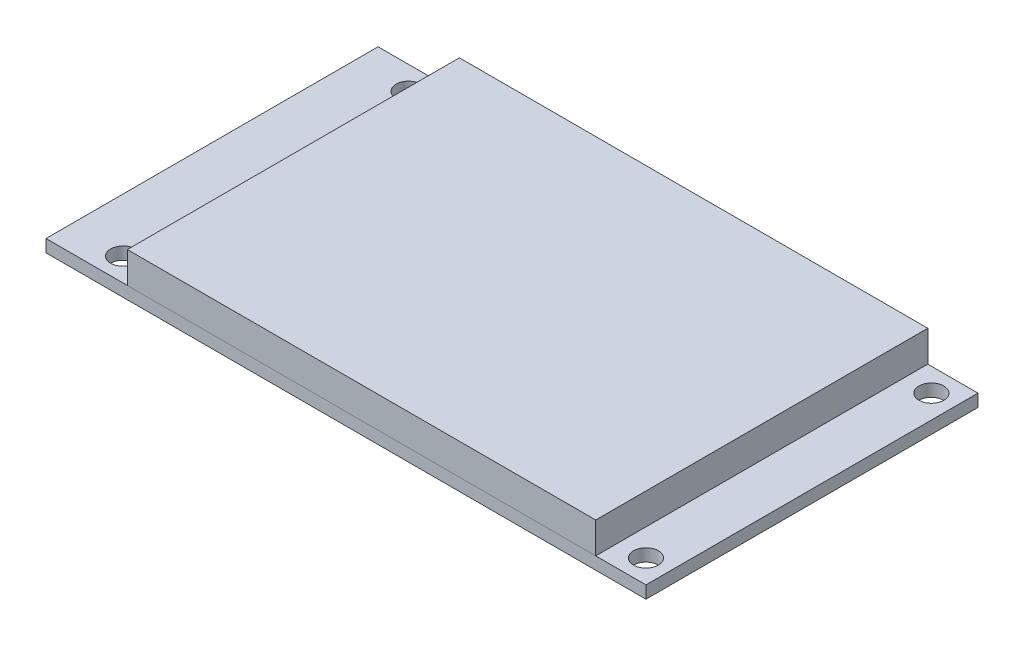
ISO-10303-21;
HEADER;
FILE_DESCRIPTION(('STEP AP214'),'2;1');
FILE_NAME('part.step','',(''),(''),'','','');
FILE_SCHEMA(('AUTOMOTIVE_DESIGN { 1 0 10303 214 1 1 1 1 }'));
ENDSEC;
DATA;
#1=APPLICATION_CONTEXT('core data for automotive mechanical design processes');
#2=APPLICATION_PROTOCOL_DEFINITION('international standard','automotive_design',2000,#1);
#3=PRODUCT_CONTEXT('',#1,'mechanical');
#4=PRODUCT('Part','Part','',(#3));
#5=PRODUCT_RELATED_PRODUCT_CATEGORY('part','',(#4));
#6=PRODUCT_DEFINITION_FORMATION('','',#4);
#7=PRODUCT_DEFINITION_CONTEXT('part definition',#1,'design');
#8=PRODUCT_DEFINITION('design','',#6,#7);
#9=PRODUCT_DEFINITION_SHAPE('','',#8);
#10=(LENGTH_UNIT() NAMED_UNIT(*) SI_UNIT(.MILLI.,.METRE.));
#11=(NAMED_UNIT(*) PLANE_ANGLE_UNIT() SI_UNIT($,.RADIAN.));
#12=(NAMED_UNIT(*) SI_UNIT($,.STERADIAN.) SOLID_ANGLE_UNIT());
#13=UNCERTAINTY_MEASURE_WITH_UNIT(LENGTH_MEASURE(1.E-05),#10,'distance_accuracy_value','');
#14=(GEOMETRIC_REPRESENTATION_CONTEXT(3) GLOBAL_UNCERTAINTY_ASSIGNED_CONTEXT((#13)) GLOBAL_UNIT_ASSIGNED_CONTEXT((#10,
#11,#12)) REPRESENTATION_CONTEXT('',''));
#15=CARTESIAN_POINT('',(0.,0.,0.));
#16=DIRECTION('',(0.,0.,1.));
#17=DIRECTION('',(1.,0.,0.));
#18=AXIS2_PLACEMENT_3D('',#15,#16,#17);
#19=CARTESIAN_POINT('',(-28.13,5.6,-21.36));
#20=DIRECTION('',(1.,0.,0.));
#21=DIRECTION('',(0.,0.,-1.));
#22=AXIS2_PLACEMENT_3D('',#19,#20,#21);
#23=PLANE('',#22);
#24=DIRECTION('',(0.,0.,1.));
#25=VECTOR('',#24,1.);
#26=CARTESIAN_POINT('',(-28.13,1.6,-21.36));
#27=LINE('',#26,#25);
#28=CARTESIAN_POINT('',(-28.13,1.6,-21.36));
#29=VERTEX_POINT('',#28);
#30=CARTESIAN_POINT('',(-28.13,1.6,21.36));
#31=VERTEX_POINT('',#30);
#32=EDGE_CURVE('E117',#29,#31,#27,.T.);
#33=ORIENTED_EDGE('',*,*,#32,.T.);
#34=DIRECTION('',(0.,-1.,0.));
#35=VECTOR('',#34,1.);
#36=CARTESIAN_POINT('',(-28.13,5.6,21.36));
#37=LINE('',#36,#35);
#38=CARTESIAN_POINT('',(-28.13,5.6,21.36));
#39=VERTEX_POINT('',#38);
#40=EDGE_CURVE('E12',#39,#31,#37,.T.);
#41=ORIENTED_EDGE('',*,*,#40,.F.);
#42=DIRECTION('',(0.,0.,1.));
#43=VECTOR('',#42,1.);
#44=CARTESIAN_POINT('',(-28.13,5.6,-21.36));
#45=LINE('',#44,#43);
#46=CARTESIAN_POINT('',(-28.13,5.6,-21.36));
#47=VERTEX_POINT('',#46);
#48=EDGE_CURVE('E101',#47,#39,#45,.T.);
#49=ORIENTED_EDGE('',*,*,#48,.F.);
#50=DIRECTION('',(0.,-1.,0.));
#51=VECTOR('',#50,1.);
#52=CARTESIAN_POINT('',(-28.13,5.6,-21.36));
#53=LINE('',#52,#51);
#54=EDGE_CURVE('E113',#47,#29,#53,.T.);
#55=ORIENTED_EDGE('',*,*,#54,.T.);
#56=EDGE_LOOP('',(#33,#41,#49,#55));
#57=FACE_BOUND('',#56,.T.);
#58=ADVANCED_FACE('F49',(#57),#23,.F.);
#59=CARTESIAN_POINT('',(-28.13,5.6,21.36));
#60=DIRECTION('',(0.,0.,-1.));
#61=DIRECTION('',(-1.,0.,0.));
#62=AXIS2_PLACEMENT_3D('',#59,#60,#61);
#63=PLANE('',#62);
#64=DIRECTION('',(1.,0.,0.));
#65=VECTOR('',#64,1.);
#66=CARTESIAN_POINT('',(-28.13,1.6,21.36));
#67=LINE('',#66,#65);
#68=CARTESIAN_POINT('',(32.13,1.6,21.36));
#69=VERTEX_POINT('',#68);
#70=EDGE_CURVE('E106',#31,#69,#67,.T.);
#71=ORIENTED_EDGE('',*,*,#70,.T.);
#72=DIRECTION('',(0.,-1.,0.));
#73=VECTOR('',#72,1.);
#74=CARTESIAN_POINT('',(32.13,5.6,21.36));
#75=LINE('',#74,#73);
#76=CARTESIAN_POINT('',(32.13,5.6,21.36));
#77=VERTEX_POINT('',#76);
#78=EDGE_CURVE('E58',#77,#69,#75,.T.);
#79=ORIENTED_EDGE('',*,*,#78,.F.);
#80=DIRECTION('',(1.,0.,0.));
#81=VECTOR('',#80,1.);
#82=CARTESIAN_POINT('',(-28.13,5.6,21.36));
#83=LINE('',#82,#81);
#84=EDGE_CURVE('E96',#39,#77,#83,.T.);
#85=ORIENTED_EDGE('',*,*,#84,.F.);
#86=ORIENTED_EDGE('',*,*,#40,.T.);
#87=EDGE_LOOP('',(#71,#79,#85,#86));
#88=FACE_BOUND('',#87,.T.);
#89=ADVANCED_FACE('F105',(#88),#63,.F.);
#90=CARTESIAN_POINT('',(32.13,5.6,-21.36));
#91=DIRECTION('',(-1.,0.,0.));
#92=DIRECTION('',(0.,0.,1.));
#93=AXIS2_PLACEMENT_3D('',#90,#91,#92);
#94=PLANE('',#93);
#95=DIRECTION('',(0.,0.,-1.));
#96=VECTOR('',#95,1.);
#97=CARTESIAN_POINT('',(32.13,1.6,-21.36));
#98=LINE('',#97,#96);
#99=CARTESIAN_POINT('',(32.13,1.6,-21.36));
#100=VERTEX_POINT('',#99);
#101=EDGE_CURVE('E83',#69,#100,#98,.T.);
#102=ORIENTED_EDGE('',*,*,#101,.T.);
#103=DIRECTION('',(0.,-1.,0.));
#104=VECTOR('',#103,1.);
#105=CARTESIAN_POINT('',(32.13,5.6,-21.36));
#106=LINE('',#105,#104);
#107=CARTESIAN_POINT('',(32.13,5.6,-21.36));
#108=VERTEX_POINT('',#107);
#109=EDGE_CURVE('E108',#108,#100,#106,.T.);
#110=ORIENTED_EDGE('',*,*,#109,.F.);
#111=DIRECTION('',(0.,0.,-1.));
#112=VECTOR('',#111,1.);
#113=CARTESIAN_POINT('',(32.13,5.6,-21.36));
#114=LINE('',#113,#112);
#115=EDGE_CURVE('E99',#77,#108,#114,.T.);
#116=ORIENTED_EDGE('',*,*,#115,.F.);
#117=ORIENTED_EDGE('',*,*,#78,.T.);
#118=EDGE_LOOP('',(#102,#110,#116,#117));
#119=FACE_BOUND('',#118,.T.);
#120=ADVANCED_FACE('F109',(#119),#94,.F.);
#121=CARTESIAN_POINT('',(-28.13,5.6,-21.36));
#122=DIRECTION('',(0.,0.,1.));
#123=DIRECTION('',(1.,0.,0.));
#124=AXIS2_PLACEMENT_3D('',#121,#122,#123);
#125=PLANE('',#124);
#126=DIRECTION('',(-1.,0.,0.));
#127=VECTOR('',#126,1.);
#128=CARTESIAN_POINT('',(-28.13,1.6,-21.36));
#129=LINE('',#128,#127);
#130=EDGE_CURVE('E89',#100,#29,#129,.T.);
#131=ORIENTED_EDGE('',*,*,#130,.T.);
#132=ORIENTED_EDGE('',*,*,#54,.F.);
#133=DIRECTION('',(-1.,0.,0.));
#134=VECTOR('',#133,1.);
#135=CARTESIAN_POINT('',(-28.13,5.6,-21.36));
#136=LINE('',#135,#134);
#137=EDGE_CURVE('E66',#108,#47,#136,.T.);
#138=ORIENTED_EDGE('',*,*,#137,.F.);
#139=ORIENTED_EDGE('',*,*,#109,.T.);
#140=EDGE_LOOP('',(#131,#132,#138,#139));
#141=FACE_BOUND('',#140,.T.);
#142=ADVANCED_FACE('F130',(#141),#125,.F.);
#143=CARTESIAN_POINT('',(0.,5.6,0.));
#144=DIRECTION('',(0.,1.,0.));
#145=DIRECTION('',(0.,0.,1.));
#146=AXIS2_PLACEMENT_3D('',#143,#144,#145);
#147=PLANE('',#146);
#148=ORIENTED_EDGE('',*,*,#48,.T.);
#149=ORIENTED_EDGE('',*,*,#84,.T.);
#150=ORIENTED_EDGE('',*,*,#115,.T.);
#151=ORIENTED_EDGE('',*,*,#137,.T.);
#152=EDGE_LOOP('',(#148,#149,#150,#151));
#153=FACE_BOUND('',#152,.T.);
#154=ADVANCED_FACE('F97',(#153),#147,.T.);
#155=CARTESIAN_POINT('',(0.,1.6,0.));
#156=DIRECTION('',(0.,1.,0.));
#157=DIRECTION('',(0.,0.,1.));
#158=AXIS2_PLACEMENT_3D('',#155,#156,#157);
#159=PLANE('',#158);
#160=ORIENTED_EDGE('',*,*,#32,.F.);
#161=ORIENTED_EDGE('',*,*,#130,.F.);
#162=ORIENTED_EDGE('',*,*,#101,.F.);
#163=ORIENTED_EDGE('',*,*,#70,.F.);
#164=EDGE_LOOP('',(#160,#161,#162,#163));
#165=FACE_BOUND('',#164,.T.);
#166=ADVANCED_FACE('F133',(#165),#159,.F.);
#167=CLOSED_SHELL('',(#58,#89,#120,#142,#154,#166));
#168=MANIFOLD_SOLID_BREP('B2',#167);
#169=CARTESIAN_POINT('',(0.,1.6,0.));
#170=DIRECTION('',(0.,-1.,0.));
#171=DIRECTION('',(0.,0.,-1.));
#172=AXIS2_PLACEMENT_3D('',#169,#170,#171);
#173=PLANE('',#172);
#174=DIRECTION('',(0.,0.,-1.));
#175=VECTOR('',#174,1.);
#176=CARTESIAN_POINT('',(38.59,1.6,21.36));
#177=LINE('',#176,#175);
#178=CARTESIAN_POINT('',(38.59,1.6,21.36));
#179=VERTEX_POINT('',#178);
#180=CARTESIAN_POINT('',(38.59,1.6,-21.36));
#181=VERTEX_POINT('',#180);
#182=EDGE_CURVE('E237',#179,#181,#177,.T.);
#183=ORIENTED_EDGE('',*,*,#182,.T.);
#184=DIRECTION('',(-1.,0.,0.));
#185=VECTOR('',#184,1.);
#186=CARTESIAN_POINT('',(-38.59,1.6,-21.36));
#187=LINE('',#186,#185);
#188=CARTESIAN_POINT('',(-38.59,1.6,-21.36));
#189=VERTEX_POINT('',#188);
#190=EDGE_CURVE('E232',#181,#189,#187,.T.);
#191=ORIENTED_EDGE('',*,*,#190,.T.);
#192=DIRECTION('',(0.,0.,1.));
#193=VECTOR('',#192,1.);
#194=CARTESIAN_POINT('',(-38.59,1.6,21.36));
#195=LINE('',#194,#193);
#196=CARTESIAN_POINT('',(-38.59,1.6,21.36));
#197=VERTEX_POINT('',#196);
#198=EDGE_CURVE('E235',#189,#197,#195,.T.);
#199=ORIENTED_EDGE('',*,*,#198,.T.);
#200=DIRECTION('',(1.,0.,0.));
#201=VECTOR('',#200,1.);
#202=CARTESIAN_POINT('',(-38.59,1.6,21.36));
#203=LINE('',#202,#201);
#204=EDGE_CURVE('E202',#197,#179,#203,.T.);
#205=ORIENTED_EDGE('',*,*,#204,.T.);
#206=EDGE_LOOP('',(#183,#191,#199,#205));
#207=FACE_BOUND('',#206,.T.);
#208=CARTESIAN_POINT('',(-31.67,1.6,-18.36));
#209=DIRECTION('',(0.,1.,0.));
#210=DIRECTION('',(0.,0.,1.));
#211=AXIS2_PLACEMENT_3D('',#208,#209,#210);
#212=CIRCLE('',#211,1.6);
#213=CARTESIAN_POINT('',(-31.67,1.6,-16.76));
#214=VERTEX_POINT('',#213);
#215=EDGE_CURVE('E252',#214,#214,#212,.T.);
#216=ORIENTED_EDGE('',*,*,#215,.F.);
#217=EDGE_LOOP('',(#216));
#218=FACE_BOUND('',#217,.T.);
#219=CARTESIAN_POINT('',(35.59,1.6,-18.36));
#220=DIRECTION('',(0.,1.,0.));
#221=DIRECTION('',(0.,0.,1.));
#222=AXIS2_PLACEMENT_3D('',#219,#220,#221);
#223=CIRCLE('',#222,1.6);
#224=CARTESIAN_POINT('',(35.59,1.6,-16.76));
#225=VERTEX_POINT('',#224);
#226=EDGE_CURVE('E267',#225,#225,#223,.T.);
#227=ORIENTED_EDGE('',*,*,#226,.F.);
#228=EDGE_LOOP('',(#227));
#229=FACE_BOUND('',#228,.T.);
#230=CARTESIAN_POINT('',(35.59,1.6,18.36));
#231=DIRECTION('',(0.,1.,0.));
#232=DIRECTION('',(0.,0.,-1.));
#233=AXIS2_PLACEMENT_3D('',#230,#231,#232);
#234=CIRCLE('',#233,1.6);
#235=CARTESIAN_POINT('',(35.59,1.6,16.76));
#236=VERTEX_POINT('',#235);
#237=EDGE_CURVE('E273',#236,#236,#234,.T.);
#238=ORIENTED_EDGE('',*,*,#237,.F.);
#239=EDGE_LOOP('',(#238));
#240=FACE_BOUND('',#239,.T.);
#241=CARTESIAN_POINT('',(-31.67,1.6,18.36));
#242=DIRECTION('',(0.,1.,0.));
#243=DIRECTION('',(0.,0.,-1.));
#244=AXIS2_PLACEMENT_3D('',#241,#242,#243);
#245=CIRCLE('',#244,1.6);
#246=CARTESIAN_POINT('',(-31.67,1.6,16.76));
#247=VERTEX_POINT('',#246);
#248=EDGE_CURVE('E279',#247,#247,#245,.T.);
#249=ORIENTED_EDGE('',*,*,#248,.F.);
#250=EDGE_LOOP('',(#249));
#251=FACE_BOUND('',#250,.T.);
#252=ADVANCED_FACE('F185',(#207,#218,#229,#240,#251),#173,.F.);
#253=CARTESIAN_POINT('',(0.,0.,0.));
#254=DIRECTION('',(0.,-1.,0.));
#255=DIRECTION('',(0.,0.,-1.));
#256=AXIS2_PLACEMENT_3D('',#253,#254,#255);
#257=PLANE('',#256);
#258=CARTESIAN_POINT('',(35.59,0.,18.36));
#259=DIRECTION('',(0.,1.,0.));
#260=DIRECTION('',(0.,0.,-1.));
#261=AXIS2_PLACEMENT_3D('',#258,#259,#260);
#262=CIRCLE('',#261,1.6);
#263=CARTESIAN_POINT('',(35.59,0.,16.76));
#264=VERTEX_POINT('',#263);
#265=EDGE_CURVE('E276',#264,#264,#262,.T.);
#266=ORIENTED_EDGE('',*,*,#265,.T.);
#267=EDGE_LOOP('',(#266));
#268=FACE_BOUND('',#267,.T.);
#269=CARTESIAN_POINT('',(-31.67,0.,-18.36));
#270=DIRECTION('',(0.,1.,0.));
#271=DIRECTION('',(0.,0.,1.));
#272=AXIS2_PLACEMENT_3D('',#269,#270,#271);
#273=CIRCLE('',#272,1.6);
#274=CARTESIAN_POINT('',(-31.67,0.,-16.76));
#275=VERTEX_POINT('',#274);
#276=EDGE_CURVE('E264',#275,#275,#273,.T.);
#277=ORIENTED_EDGE('',*,*,#276,.T.);
#278=EDGE_LOOP('',(#277));
#279=FACE_BOUND('',#278,.T.);
#280=DIRECTION('',(0.,0.,-1.));
#281=VECTOR('',#280,1.);
#282=CARTESIAN_POINT('',(38.59,0.,21.36));
#283=LINE('',#282,#281);
#284=CARTESIAN_POINT('',(38.59,0.,21.36));
#285=VERTEX_POINT('',#284);
#286=CARTESIAN_POINT('',(38.59,0.,-21.36));
#287=VERTEX_POINT('',#286);
#288=EDGE_CURVE('E249',#285,#287,#283,.T.);
#289=ORIENTED_EDGE('',*,*,#288,.F.);
#290=DIRECTION('',(1.,0.,0.));
#291=VECTOR('',#290,1.);
#292=CARTESIAN_POINT('',(-38.59,0.,21.36));
#293=LINE('',#292,#291);
#294=CARTESIAN_POINT('',(-38.59,0.,21.36));
#295=VERTEX_POINT('',#294);
#296=EDGE_CURVE('E225',#295,#285,#293,.T.);
#297=ORIENTED_EDGE('',*,*,#296,.F.);
#298=DIRECTION('',(0.,0.,1.));
#299=VECTOR('',#298,1.);
#300=CARTESIAN_POINT('',(-38.59,0.,21.36));
#301=LINE('',#300,#299);
#302=CARTESIAN_POINT('',(-38.59,0.,-21.36));
#303=VERTEX_POINT('',#302);
#304=EDGE_CURVE('E219',#303,#295,#301,.T.);
#305=ORIENTED_EDGE('',*,*,#304,.F.);
#306=DIRECTION('',(-1.,0.,0.));
#307=VECTOR('',#306,1.);
#308=CARTESIAN_POINT('',(-38.59,0.,-21.36));
#309=LINE('',#308,#307);
#310=EDGE_CURVE('E241',#287,#303,#309,.T.);
#311=ORIENTED_EDGE('',*,*,#310,.F.);
#312=EDGE_LOOP('',(#289,#297,#305,#311));
#313=FACE_BOUND('',#312,.T.);
#314=CARTESIAN_POINT('',(35.59,0.,-18.36));
#315=DIRECTION('',(0.,1.,0.));
#316=DIRECTION('',(0.,0.,1.));
#317=AXIS2_PLACEMENT_3D('',#314,#315,#316);
#318=CIRCLE('',#317,1.6);
#319=CARTESIAN_POINT('',(35.59,0.,-16.76));
#320=VERTEX_POINT('',#319);
#321=EDGE_CURVE('E270',#320,#320,#318,.T.);
#322=ORIENTED_EDGE('',*,*,#321,.T.);
#323=EDGE_LOOP('',(#322));
#324=FACE_BOUND('',#323,.T.);
#325=CARTESIAN_POINT('',(-31.67,0.,18.36));
#326=DIRECTION('',(0.,1.,0.));
#327=DIRECTION('',(0.,0.,-1.));
#328=AXIS2_PLACEMENT_3D('',#325,#326,#327);
#329=CIRCLE('',#328,1.6);
#330=CARTESIAN_POINT('',(-31.67,0.,16.76));
#331=VERTEX_POINT('',#330);
#332=EDGE_CURVE('E282',#331,#331,#329,.T.);
#333=ORIENTED_EDGE('',*,*,#332,.T.);
#334=EDGE_LOOP('',(#333));
#335=FACE_BOUND('',#334,.T.);
#336=ADVANCED_FACE('F260',(#268,#279,#313,#324,#335),#257,.T.);
#337=CARTESIAN_POINT('',(38.59,1.6,21.36));
#338=DIRECTION('',(-1.,0.,0.));
#339=DIRECTION('',(0.,0.,1.));
#340=AXIS2_PLACEMENT_3D('',#337,#338,#339);
#341=PLANE('',#340);
#342=ORIENTED_EDGE('',*,*,#288,.T.);
#343=DIRECTION('',(0.,-1.,0.));
#344=VECTOR('',#343,1.);
#345=CARTESIAN_POINT('',(38.59,1.6,-21.36));
#346=LINE('',#345,#344);
#347=EDGE_CURVE('E47',#181,#287,#346,.T.);
#348=ORIENTED_EDGE('',*,*,#347,.F.);
#349=ORIENTED_EDGE('',*,*,#182,.F.);
#350=DIRECTION('',(0.,-1.,0.));
#351=VECTOR('',#350,1.);
#352=CARTESIAN_POINT('',(38.59,1.6,21.36));
#353=LINE('',#352,#351);
#354=EDGE_CURVE('E245',#179,#285,#353,.T.);
#355=ORIENTED_EDGE('',*,*,#354,.T.);
#356=EDGE_LOOP('',(#342,#348,#349,#355));
#357=FACE_BOUND('',#356,.T.);
#358=ADVANCED_FACE('F187',(#357),#341,.F.);
#359=CARTESIAN_POINT('',(-38.59,1.6,-21.36));
#360=DIRECTION('',(0.,0.,1.));
#361=DIRECTION('',(1.,0.,0.));
#362=AXIS2_PLACEMENT_3D('',#359,#360,#361);
#363=PLANE('',#362);
#364=ORIENTED_EDGE('',*,*,#310,.T.);
#365=DIRECTION('',(0.,-1.,0.));
#366=VECTOR('',#365,1.);
#367=CARTESIAN_POINT('',(-38.59,1.6,-21.36));
#368=LINE('',#367,#366);
#369=EDGE_CURVE('E194',#189,#303,#368,.T.);
#370=ORIENTED_EDGE('',*,*,#369,.F.);
#371=ORIENTED_EDGE('',*,*,#190,.F.);
#372=ORIENTED_EDGE('',*,*,#347,.T.);
#373=EDGE_LOOP('',(#364,#370,#371,#372));
#374=FACE_BOUND('',#373,.T.);
#375=ADVANCED_FACE('F240',(#374),#363,.F.);
#376=CARTESIAN_POINT('',(-38.59,1.6,21.36));
#377=DIRECTION('',(1.,0.,0.));
#378=DIRECTION('',(0.,0.,-1.));
#379=AXIS2_PLACEMENT_3D('',#376,#377,#378);
#380=PLANE('',#379);
#381=ORIENTED_EDGE('',*,*,#304,.T.);
#382=DIRECTION('',(0.,-1.,0.));
#383=VECTOR('',#382,1.);
#384=CARTESIAN_POINT('',(-38.59,1.6,21.36));
#385=LINE('',#384,#383);
#386=EDGE_CURVE('E242',#197,#295,#385,.T.);
#387=ORIENTED_EDGE('',*,*,#386,.F.);
#388=ORIENTED_EDGE('',*,*,#198,.F.);
#389=ORIENTED_EDGE('',*,*,#369,.T.);
#390=EDGE_LOOP('',(#381,#387,#388,#389));
#391=FACE_BOUND('',#390,.T.);
#392=ADVANCED_FACE('F243',(#391),#380,.F.);
#393=CARTESIAN_POINT('',(-38.59,1.6,21.36));
#394=DIRECTION('',(0.,0.,-1.));
#395=DIRECTION('',(-1.,0.,0.));
#396=AXIS2_PLACEMENT_3D('',#393,#394,#395);
#397=PLANE('',#396);
#398=ORIENTED_EDGE('',*,*,#296,.T.);
#399=ORIENTED_EDGE('',*,*,#354,.F.);
#400=ORIENTED_EDGE('',*,*,#204,.F.);
#401=ORIENTED_EDGE('',*,*,#386,.T.);
#402=EDGE_LOOP('',(#398,#399,#400,#401));
#403=FACE_BOUND('',#402,.T.);
#404=ADVANCED_FACE('F257',(#403),#397,.F.);
#405=CARTESIAN_POINT('',(-31.67,1.6,-18.36));
#406=DIRECTION('',(0.,-1.,0.));
#407=DIRECTION('',(0.,0.,-1.));
#408=AXIS2_PLACEMENT_3D('',#405,#406,#407);
#409=CYLINDRICAL_SURFACE('',#408,1.6);
#410=ORIENTED_EDGE('',*,*,#215,.T.);
#411=EDGE_LOOP('',(#410));
#412=FACE_BOUND('',#411,.T.);
#413=ORIENTED_EDGE('',*,*,#276,.F.);
#414=EDGE_LOOP('',(#413));
#415=FACE_BOUND('',#414,.T.);
#416=ADVANCED_FACE('F299',(#412,#415),#409,.F.);
#417=CARTESIAN_POINT('',(35.59,1.6,-18.36));
#418=DIRECTION('',(0.,-1.,0.));
#419=DIRECTION('',(0.,0.,-1.));
#420=AXIS2_PLACEMENT_3D('',#417,#418,#419);
#421=CYLINDRICAL_SURFACE('',#420,1.6);
#422=ORIENTED_EDGE('',*,*,#226,.T.);
#423=EDGE_LOOP('',(#422));
#424=FACE_BOUND('',#423,.T.);
#425=ORIENTED_EDGE('',*,*,#321,.F.);
#426=EDGE_LOOP('',(#425));
#427=FACE_BOUND('',#426,.T.);
#428=ADVANCED_FACE('F345',(#424,#427),#421,.F.);
#429=CARTESIAN_POINT('',(35.59,1.6,18.36));
#430=DIRECTION('',(0.,-1.,0.));
#431=DIRECTION('',(0.,0.,-1.));
#432=AXIS2_PLACEMENT_3D('',#429,#430,#431);
#433=CYLINDRICAL_SURFACE('',#432,1.6);
#434=ORIENTED_EDGE('',*,*,#237,.T.);
#435=EDGE_LOOP('',(#434));
#436=FACE_BOUND('',#435,.T.);
#437=ORIENTED_EDGE('',*,*,#265,.F.);
#438=EDGE_LOOP('',(#437));
#439=FACE_BOUND('',#438,.T.);
#440=ADVANCED_FACE('F353',(#436,#439),#433,.F.);
#441=CARTESIAN_POINT('',(-31.67,1.6,18.36));
#442=DIRECTION('',(0.,-1.,0.));
#443=DIRECTION('',(0.,0.,-1.));
#444=AXIS2_PLACEMENT_3D('',#441,#442,#443);
#445=CYLINDRICAL_SURFACE('',#444,1.6);
#446=ORIENTED_EDGE('',*,*,#248,.T.);
#447=EDGE_LOOP('',(#446));
#448=FACE_BOUND('',#447,.T.);
#449=ORIENTED_EDGE('',*,*,#332,.F.);
#450=EDGE_LOOP('',(#449));
#451=FACE_BOUND('',#450,.T.);
#452=ADVANCED_FACE('F288',(#448,#451),#445,.F.);
#453=CLOSED_SHELL('',(#252,#336,#358,#375,#392,#404,#416,#428,#440,#452));
#454=MANIFOLD_SOLID_BREP('B6',#453);
#455=ADVANCED_BREP_SHAPE_REPRESENTATION('',(#18,#168,#454),#14);
#456=SHAPE_DEFINITION_REPRESENTATION(#9,#455);
ENDSEC;
END-ISO-10303-21;
